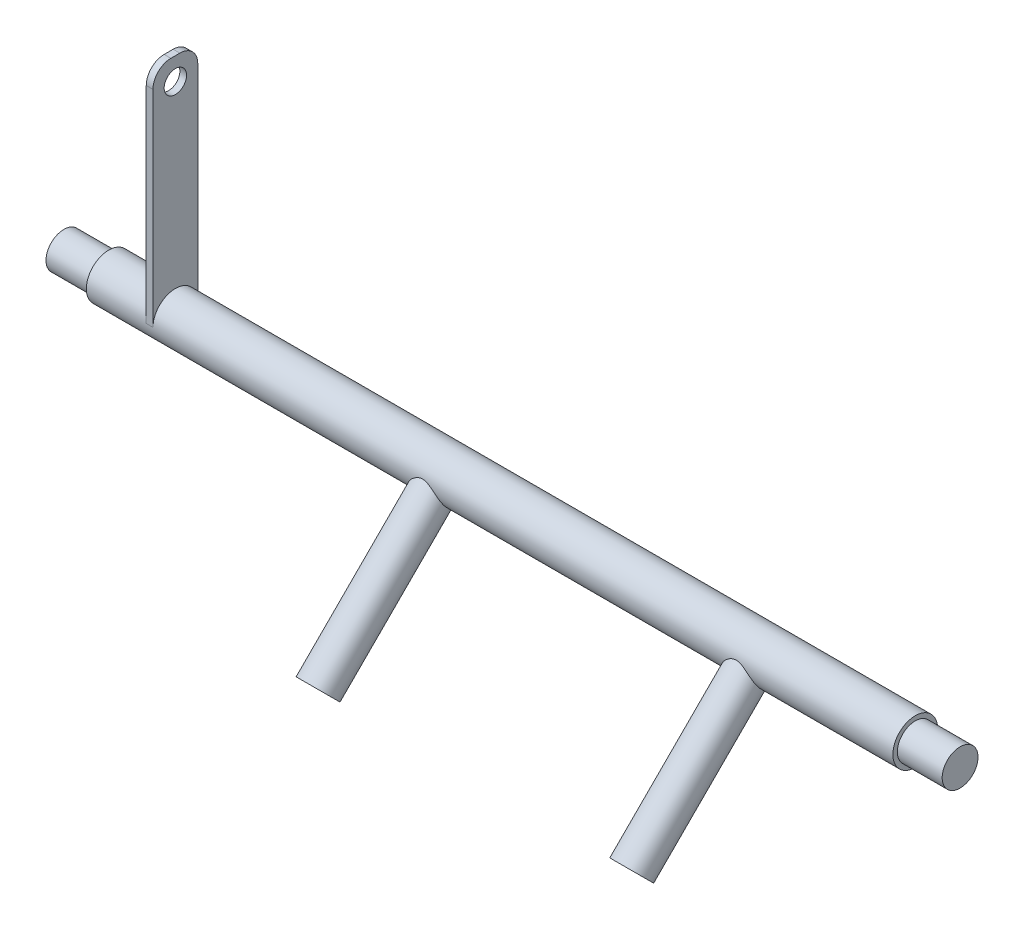
ISO-10303-21;
HEADER;
FILE_DESCRIPTION(('STEP AP214'),'2;1');
FILE_NAME('part.step','',(''),(''),'','','');
FILE_SCHEMA(('AUTOMOTIVE_DESIGN { 1 0 10303 214 1 1 1 1 }'));
ENDSEC;
DATA;
#1=APPLICATION_CONTEXT('core data for automotive mechanical design processes');
#2=APPLICATION_PROTOCOL_DEFINITION('international standard','automotive_design',2000,#1);
#3=PRODUCT_CONTEXT('',#1,'mechanical');
#4=PRODUCT('Part','Part','',(#3));
#5=PRODUCT_RELATED_PRODUCT_CATEGORY('part','',(#4));
#6=PRODUCT_DEFINITION_FORMATION('','',#4);
#7=PRODUCT_DEFINITION_CONTEXT('part definition',#1,'design');
#8=PRODUCT_DEFINITION('design','',#6,#7);
#9=PRODUCT_DEFINITION_SHAPE('','',#8);
#10=(LENGTH_UNIT() NAMED_UNIT(*) SI_UNIT(.MILLI.,.METRE.));
#11=(NAMED_UNIT(*) PLANE_ANGLE_UNIT() SI_UNIT($,.RADIAN.));
#12=(NAMED_UNIT(*) SI_UNIT($,.STERADIAN.) SOLID_ANGLE_UNIT());
#13=UNCERTAINTY_MEASURE_WITH_UNIT(LENGTH_MEASURE(1.E-05),#10,'distance_accuracy_value','');
#14=(GEOMETRIC_REPRESENTATION_CONTEXT(3) GLOBAL_UNCERTAINTY_ASSIGNED_CONTEXT((#13)) GLOBAL_UNIT_ASSIGNED_CONTEXT((#10,
#11,#12)) REPRESENTATION_CONTEXT('',''));
#15=CARTESIAN_POINT('',(0.,0.,0.));
#16=DIRECTION('',(0.,0.,1.));
#17=DIRECTION('',(1.,0.,0.));
#18=AXIS2_PLACEMENT_3D('',#15,#16,#17);
#19=CARTESIAN_POINT('',(200.,0.,0.));
#20=DIRECTION('',(-1.,0.,0.));
#21=DIRECTION('',(0.,0.,1.));
#22=AXIS2_PLACEMENT_3D('',#19,#20,#21);
#23=CYLINDRICAL_SURFACE('',#22,5.);
#24=CARTESIAN_POINT('',(86.8708289867169,0.,5.));
#25=CARTESIAN_POINT('',(86.9793998289822,-0.0812449391836092,4.99999920723166));
#26=CARTESIAN_POINT('',(87.0846153933995,-0.167032491447262,4.99801059737279));
#27=CARTESIAN_POINT('',(87.2884195353464,-0.345985964613619,4.98882133742379));
#28=CARTESIAN_POINT('',(87.3870028202996,-0.439157651922428,4.98161657751041));
#29=CARTESIAN_POINT('',(87.5776903995443,-0.631819299395804,4.96086844537602));
#30=CARTESIAN_POINT('',(87.6697747980685,-0.731327026199723,4.94730650399507));
#31=CARTESIAN_POINT('',(87.8467818851657,-0.935218036419223,4.91284702152889));
#32=CARTESIAN_POINT('',(87.931707374863,-1.03959938781692,4.89195236625242));
#33=CARTESIAN_POINT('',(88.1487102981684,-1.32403399682275,4.82497264035388));
#34=CARTESIAN_POINT('',(88.273990478684,-1.50767405850661,4.77140108410998));
#35=CARTESIAN_POINT('',(88.4991429971622,-1.88020909808587,4.63722518255168));
#36=CARTESIAN_POINT('',(88.5990756014864,-2.06909040415137,4.55668603457269));
#37=CARTESIAN_POINT('',(88.7540009903399,-2.4129895906888,4.38268184213806));
#38=CARTESIAN_POINT('',(88.8137833552939,-2.56819480481162,4.29388671176773));
#39=CARTESIAN_POINT('',(88.9097128085373,-2.87306886064256,4.09614605262623));
#40=CARTESIAN_POINT('',(88.9458700950944,-3.02274006486603,3.98720924452791));
#41=CARTESIAN_POINT('',(88.9923709406414,-3.31189065852307,3.75052000535699));
#42=CARTESIAN_POINT('',(89.0026129281885,-3.45132787189528,3.62269561075527));
#43=CARTESIAN_POINT('',(88.9962510880836,-3.71445861393116,3.35236740261508));
#44=CARTESIAN_POINT('',(88.9796485274838,-3.8381528853583,3.20986428220398));
#45=CARTESIAN_POINT('',(88.922667880246,-4.05912518840542,2.92472060847231));
#46=CARTESIAN_POINT('',(88.8838725384551,-4.15758438185366,2.78266766203189));
#47=CARTESIAN_POINT('',(88.7858869903079,-4.33663626358225,2.49447319654389));
#48=CARTESIAN_POINT('',(88.7266916715949,-4.41722446495655,2.34833066106386));
#49=CARTESIAN_POINT('',(88.5845549345228,-4.5669018225551,2.04321503312601));
#50=CARTESIAN_POINT('',(88.5000084258755,-4.63440465715769,1.88422004971271));
#51=CARTESIAN_POINT('',(88.3128859017784,-4.75009362429946,1.56993571483436));
#52=CARTESIAN_POINT('',(88.2103012038964,-4.79827041770672,1.4146481889706));
#53=CARTESIAN_POINT('',(87.9672691927458,-4.88551380226254,1.08041085345886));
#54=CARTESIAN_POINT('',(87.8233579292091,-4.92078698722834,0.903000319213625));
#55=CARTESIAN_POINT('',(87.5153697839587,-4.97116550800172,0.563040506268428));
#56=CARTESIAN_POINT('',(87.3512652235056,-4.98624281762266,0.400512170458568));
#57=CARTESIAN_POINT('',(87.0949084622267,-4.99741493006413,0.176407866343933));
#58=CARTESIAN_POINT('',(87.0100226419083,-4.99931535599653,0.106530036922283));
#59=CARTESIAN_POINT('',(86.8357782991457,-5.000372427147,-0.0275095370232505));
#60=CARTESIAN_POINT('',(86.7464190952593,-4.99952865307388,-0.091670406503846));
#61=CARTESIAN_POINT('',(86.5633358001229,-4.99582834453642,-0.21302369711527));
#62=CARTESIAN_POINT('',(86.4696199892205,-4.99297549339157,-0.270228646092274));
#63=CARTESIAN_POINT('',(86.2776660986073,-4.9860983379572,-0.376366645891483));
#64=CARTESIAN_POINT('',(86.1794289890549,-4.98207428400121,-0.425301460847371));
#65=CARTESIAN_POINT('',(85.9431164314671,-4.97233281886664,-0.528649419926916));
#66=CARTESIAN_POINT('',(85.8031790391184,-4.96651752182445,-0.578938414447918));
#67=CARTESIAN_POINT('',(85.5170912798506,-4.95690993688661,-0.656208229074297));
#68=CARTESIAN_POINT('',(85.3709561888701,-4.95311295532206,-0.683243218641756));
#69=CARTESIAN_POINT('',(85.0750403107533,-4.94928927739125,-0.710467851279436));
#70=CARTESIAN_POINT('',(84.9252416299379,-4.9492880747863,-0.710475972596045));
#71=CARTESIAN_POINT('',(84.6281475117094,-4.95312208776744,-0.683178530638466));
#72=CARTESIAN_POINT('',(84.4808554889329,-4.95696216750018,-0.65583833668592));
#73=CARTESIAN_POINT('',(84.160817198815,-4.96774786838422,-0.56898267951343));
#74=CARTESIAN_POINT('',(83.9897086894757,-4.97519469334109,-0.503657017694584));
#75=CARTESIAN_POINT('',(83.659688534087,-4.98856798078884,-0.346891660592394));
#76=CARTESIAN_POINT('',(83.5008149584119,-4.9944898222951,-0.255374328232258));
#77=CARTESIAN_POINT('',(83.2360623467594,-4.99991298267038,-0.0801801706545031));
#78=CARTESIAN_POINT('',(83.1272791776805,-5.00069803367004,-0.000829607363795815));
#79=CARTESIAN_POINT('',(82.9162841741232,-4.99793464074269,0.166191784138533));
#80=CARTESIAN_POINT('',(82.8140751740747,-4.99438434065401,0.253866161328792));
#81=CARTESIAN_POINT('',(82.6161425591152,-4.98178671217353,0.436069451259334));
#82=CARTESIAN_POINT('',(82.5204258350748,-4.97273364160196,0.530605433266652));
#83=CARTESIAN_POINT('',(82.3357447537895,-4.94809609280773,0.725235871264799));
#84=CARTESIAN_POINT('',(82.2467793231257,-4.93251265545843,0.825329439228892));
#85=CARTESIAN_POINT('',(82.0744168724165,-4.89351619925577,1.03186209540899));
#86=CARTESIAN_POINT('',(81.9911471135487,-4.86996878823433,1.1383824061148));
#87=CARTESIAN_POINT('',(81.8325460578982,-4.8141830298487,1.35504967960096));
#88=CARTESIAN_POINT('',(81.7572159932825,-4.7819433362769,1.46519720182007));
#89=CARTESIAN_POINT('',(81.6155232442639,-4.70802141513693,1.68766961426688));
#90=CARTESIAN_POINT('',(81.5491375373742,-4.66636419882207,1.79998802921589));
#91=CARTESIAN_POINT('',(81.4261609218319,-4.57291246986985,2.02568402007234));
#92=CARTESIAN_POINT('',(81.3695647629133,-4.52112342302892,2.13906099365595));
#93=CARTESIAN_POINT('',(81.2482741283435,-4.38568418185538,2.40747026863315));
#94=CARTESIAN_POINT('',(81.1883499956877,-4.29733887451242,2.56237032970448));
#95=CARTESIAN_POINT('',(81.092027867841,-4.10063724671074,2.86662562935454));
#96=CARTESIAN_POINT('',(81.0556118004243,-3.99229638077485,3.01598504393724));
#97=CARTESIAN_POINT('',(81.0084103996221,-3.75683600697762,3.30469114569692));
#98=CARTESIAN_POINT('',(80.9977298994759,-3.62964192480717,3.44399464465915));
#99=CARTESIAN_POINT('',(81.0030791691099,-3.36055982353189,3.70702482934759));
#100=CARTESIAN_POINT('',(81.019109163184,-3.21867168104714,3.83075138426133));
#101=CARTESIAN_POINT('',(81.0749615094739,-2.93431192428598,4.05219955811243));
#102=CARTESIAN_POINT('',(81.1132625853649,-2.79241104297494,4.15105143305933));
#103=CARTESIAN_POINT('',(81.2103117845329,-2.50442656572733,4.33090066314396));
#104=CARTESIAN_POINT('',(81.2690650907969,-2.3583419181645,4.41189348394876));
#105=CARTESIAN_POINT('',(81.4102217837965,-2.05351390641937,4.56227608862381));
#106=CARTESIAN_POINT('',(81.4942019578293,-1.8947420978273,4.6301110306738));
#107=CARTESIAN_POINT('',(81.6801948576486,-1.58081296315063,4.74648307685641));
#108=CARTESIAN_POINT('',(81.7822160251264,-1.42565736778917,4.79501111225798));
#109=CARTESIAN_POINT('',(82.0239162840215,-1.09172754541359,4.88299291240358));
#110=CARTESIAN_POINT('',(82.1670436894283,-0.914464780408133,4.91866927729797));
#111=CARTESIAN_POINT('',(82.4734088546489,-0.574612377973818,4.96984168702713));
#112=CARTESIAN_POINT('',(82.6366745696285,-0.412043692858507,4.98530932593476));
#113=CARTESIAN_POINT('',(82.8924423998191,-0.187046159721003,4.9970385425733));
#114=CARTESIAN_POINT('',(82.9776494693382,-0.116464948777004,4.99910308574929));
#115=CARTESIAN_POINT('',(83.1525900051176,0.0189552023215713,5.00042149540271));
#116=CARTESIAN_POINT('',(83.2423241910143,0.0837932249883831,4.99967491362224));
#117=CARTESIAN_POINT('',(83.4262150531255,0.206465620718764,4.99611168920189));
#118=CARTESIAN_POINT('',(83.520363548209,0.264312290239734,4.99329874446812));
#119=CARTESIAN_POINT('',(83.7132416934827,0.371680970075048,4.98645639161623));
#120=CARTESIAN_POINT('',(83.8119703385339,0.421204795958333,4.98242724934055));
#121=CARTESIAN_POINT('',(84.0488431364019,0.525552535593888,4.9726664268951));
#122=CARTESIAN_POINT('',(84.1888349994453,0.576310946396936,4.96682691965331));
#123=CARTESIAN_POINT('',(84.4750757153564,0.654534634413693,4.95713493532564));
#124=CARTESIAN_POINT('',(84.6213079797464,0.682058062477543,4.95327750716988));
#125=CARTESIAN_POINT('',(84.9174980349818,0.710232528218735,4.94932454719344));
#126=CARTESIAN_POINT('',(85.0674740980256,0.710704194009461,4.94925412603919));
#127=CARTESIAN_POINT('',(85.3650919941378,0.684222598254291,4.95297689025751));
#128=CARTESIAN_POINT('',(85.5127288961562,0.657217656752917,4.95677735628383));
#129=CARTESIAN_POINT('',(85.8329623097259,0.571096938106033,4.96750075206886));
#130=CARTESIAN_POINT('',(86.0039543326039,0.50624927397547,4.97492485320539));
#131=CARTESIAN_POINT('',(86.3334138583118,0.35057293146235,4.98830030992202));
#132=CARTESIAN_POINT('',(86.4918756950361,0.259732584066978,4.99425100179468));
#133=CARTESIAN_POINT('',(86.6825991177065,0.13411047249935,4.99826700589143));
#134=CARTESIAN_POINT('',(86.720815119702,0.108066301448417,4.99890311623502));
#135=CARTESIAN_POINT('',(86.7964266253376,0.0548567793628572,4.99976959957476));
#136=CARTESIAN_POINT('',(86.8338227109648,0.0276922658069492,5.00000027021439));
#137=CARTESIAN_POINT('',(86.8708289867169,0.,5.));
#138=B_SPLINE_CURVE_WITH_KNOTS('',3,(#24,#25,#26,#27,#28,#29,#30,#31,#32,#33,#34,#35,#36,#37,
#38,#39,#40,#41,#42,#43,#44,#45,#46,#47,#48,#49,#50,#51,#52,#53,#54,#55,#56,#57,#58,#59,#60,#61,
#62,#63,#64,#65,#66,#67,#68,#69,#70,#71,#72,#73,#74,#75,#76,#77,#78,#79,#80,#81,#82,#83,#84,#85,
#86,#87,#88,#89,#90,#91,#92,#93,#94,#95,#96,#97,#98,#99,#100,#101,#102,#103,#104,#105,#106,#107,
#108,#109,#110,#111,#112,#113,#114,#115,#116,#117,#118,#119,#120,#121,#122,#123,#124,#125,#126,
#127,#128,#129,#130,#131,#132,#133,#134,#135,#136,#137),.UNSPECIFIED.,.T.,.F.,(4,2,2,2,2,2,2,2,
2,2,2,2,2,2,2,2,2,2,2,2,2,2,2,2,2,2,2,2,2,2,2,2,2,2,2,2,2,2,2,2,2,2,2,2,2,2,2,2,2,2,2,2,2,2,2,2,
4),(0.,0.406762912918887,0.813846665058631,1.22212697930271,1.63024679361965,2.31342755131917,
2.99496842311953,3.55821424620046,4.1212167713277,4.68642251307253,5.25160157810565,
5.78075961901954,6.31005036666834,6.88488877781848,7.46000464068337,8.15103889185242,
8.84303111385966,9.17271095842023,9.50244117771741,9.83156845815155,10.1606254423376,
10.6053889046476,11.0491134768368,11.4958182500705,11.9430893944739,12.4899837252009,
13.0385162493637,13.4419957170784,13.845647993353,14.2497222084783,14.6537320428073,
15.0649312014861,15.4761940807971,15.8863772902242,16.2963398261777,16.8582152922313,
17.4196582909128,17.9833844769779,18.5471153968017,19.0762333891763,19.6054855679205,
20.1793774031676,20.7535384862844,21.4429630681143,22.1333556847298,22.4651274404409,
22.7969521022351,23.1281843819725,23.459344311697,23.9047482217928,24.3490340739624,
24.7962655102383,25.2443396890095,25.7904272318025,26.3367603178241,26.4755069976842,
26.6141517775086),.UNSPECIFIED.);
#139=CARTESIAN_POINT('',(86.8708289867169,0.,5.));
#140=VERTEX_POINT('',#139);
#141=EDGE_CURVE('E45',#140,#140,#138,.T.);
#142=ORIENTED_EDGE('',*,*,#141,.T.);
#143=EDGE_LOOP('',(#142));
#144=FACE_BOUND('',#143,.T.);
#145=CARTESIAN_POINT('',(156.870828986717,0.,5.));
#146=CARTESIAN_POINT('',(156.979399828983,-0.0812449391836084,4.99999920723166));
#147=CARTESIAN_POINT('',(157.0846153934,-0.167032491447264,4.99801059737279));
#148=CARTESIAN_POINT('',(157.288419535347,-0.345985964613618,4.98882133742379));
#149=CARTESIAN_POINT('',(157.3870028203,-0.439157651922423,4.98161657751042));
#150=CARTESIAN_POINT('',(157.577690399545,-0.631819299395794,4.96086844537603));
#151=CARTESIAN_POINT('',(157.669774798069,-0.731327026199714,4.94730650399507));
#152=CARTESIAN_POINT('',(157.846781885166,-0.935218036419212,4.91284702152889));
#153=CARTESIAN_POINT('',(157.931707374863,-1.03959938781691,4.89195236625242));
#154=CARTESIAN_POINT('',(158.148710298169,-1.32403399682273,4.82497264035388));
#155=CARTESIAN_POINT('',(158.273990478684,-1.5076740585066,4.77140108410998));
#156=CARTESIAN_POINT('',(158.499142997162,-1.88020909808586,4.63722518255169));
#157=CARTESIAN_POINT('',(158.599075601487,-2.06909040415136,4.5566860345727));
#158=CARTESIAN_POINT('',(158.75400099034,-2.4129895906888,4.38268184213806));
#159=CARTESIAN_POINT('',(158.813783355294,-2.56819480481162,4.29388671176774));
#160=CARTESIAN_POINT('',(158.909712808538,-2.87306886064256,4.09614605262624));
#161=CARTESIAN_POINT('',(158.945870095095,-3.02274006486603,3.98720924452791));
#162=CARTESIAN_POINT('',(158.992370940642,-3.31189065852308,3.75052000535699));
#163=CARTESIAN_POINT('',(159.002612928189,-3.45132787189528,3.62269561075526));
#164=CARTESIAN_POINT('',(158.996251088084,-3.71445861393117,3.35236740261507));
#165=CARTESIAN_POINT('',(158.979648527484,-3.83815288535831,3.20986428220397));
#166=CARTESIAN_POINT('',(158.922667880246,-4.05912518840543,2.9247206084723));
#167=CARTESIAN_POINT('',(158.883872538455,-4.15758438185366,2.78266766203187));
#168=CARTESIAN_POINT('',(158.785886990308,-4.33663626358226,2.49447319654388));
#169=CARTESIAN_POINT('',(158.726691671595,-4.41722446495656,2.34833066106385));
#170=CARTESIAN_POINT('',(158.584554934523,-4.5669018225551,2.043215033126));
#171=CARTESIAN_POINT('',(158.500008425876,-4.63440465715769,1.8842200497127));
#172=CARTESIAN_POINT('',(158.312885901779,-4.75009362429946,1.56993571483436));
#173=CARTESIAN_POINT('',(158.210301203897,-4.79827041770672,1.4146481889706));
#174=CARTESIAN_POINT('',(157.967269192746,-4.88551380226254,1.08041085345885));
#175=CARTESIAN_POINT('',(157.823357929209,-4.92078698722834,0.903000319213614));
#176=CARTESIAN_POINT('',(157.515369783959,-4.97116550800172,0.563040506268414));
#177=CARTESIAN_POINT('',(157.351265223506,-4.98624281762266,0.400512170458555));
#178=CARTESIAN_POINT('',(157.094908462227,-4.99741493006413,0.176407866343919));
#179=CARTESIAN_POINT('',(157.010022641909,-4.99931535599653,0.10653003692227));
#180=CARTESIAN_POINT('',(156.835778299146,-5.000372427147,-0.0275095370232689));
#181=CARTESIAN_POINT('',(156.74641909526,-4.99952865307388,-0.091670406503871));
#182=CARTESIAN_POINT('',(156.563335800123,-4.99582834453642,-0.213023697115302));
#183=CARTESIAN_POINT('',(156.469619989221,-4.99297549339157,-0.270228646092308));
#184=CARTESIAN_POINT('',(156.277666098608,-4.9860983379572,-0.376366645891516));
#185=CARTESIAN_POINT('',(156.179428989055,-4.98207428400121,-0.425301460847405));
#186=CARTESIAN_POINT('',(155.943116431467,-4.97233281886664,-0.528649419926949));
#187=CARTESIAN_POINT('',(155.803179039119,-4.96651752182445,-0.578938414447949));
#188=CARTESIAN_POINT('',(155.517091279851,-4.95690993688661,-0.656208229074319));
#189=CARTESIAN_POINT('',(155.37095618887,-4.95311295532206,-0.683243218641771));
#190=CARTESIAN_POINT('',(155.075040310754,-4.94928927739125,-0.710467851279448));
#191=CARTESIAN_POINT('',(154.925241629938,-4.9492880747863,-0.71047597259606));
#192=CARTESIAN_POINT('',(154.62814751171,-4.95312208776744,-0.683178530638481));
#193=CARTESIAN_POINT('',(154.480855488933,-4.95696216750018,-0.65583833668593));
#194=CARTESIAN_POINT('',(154.160817198815,-4.96774786838422,-0.568982679513434));
#195=CARTESIAN_POINT('',(153.989708689476,-4.97519469334109,-0.503657017694588));
#196=CARTESIAN_POINT('',(153.659688534087,-4.98856798078884,-0.346891660592405));
#197=CARTESIAN_POINT('',(153.500814958412,-4.9944898222951,-0.255374328232276));
#198=CARTESIAN_POINT('',(153.23606234676,-4.99991298267038,-0.080180170654516));
#199=CARTESIAN_POINT('',(153.127279177681,-5.00069803367004,-0.000829607363803336));
#200=CARTESIAN_POINT('',(152.916284174123,-4.99793464074269,0.166191784138532));
#201=CARTESIAN_POINT('',(152.814075174075,-4.99438434065401,0.253866161328792));
#202=CARTESIAN_POINT('',(152.616142559115,-4.98178671217353,0.436069451259333));
#203=CARTESIAN_POINT('',(152.520425835075,-4.97273364160196,0.530605433266647));
#204=CARTESIAN_POINT('',(152.33574475379,-4.94809609280773,0.725235871264789));
#205=CARTESIAN_POINT('',(152.246779323126,-4.93251265545843,0.825329439228882));
#206=CARTESIAN_POINT('',(152.074416872417,-4.89351619925577,1.03186209540899));
#207=CARTESIAN_POINT('',(151.991147113549,-4.86996878823433,1.13838240611481));
#208=CARTESIAN_POINT('',(151.832546057898,-4.8141830298487,1.35504967960097));
#209=CARTESIAN_POINT('',(151.757215993283,-4.7819433362769,1.46519720182007));
#210=CARTESIAN_POINT('',(151.615523244264,-4.70802141513693,1.68766961426688));
#211=CARTESIAN_POINT('',(151.549137537374,-4.66636419882206,1.7999880292159));
#212=CARTESIAN_POINT('',(151.426160921832,-4.57291246986984,2.02568402007236));
#213=CARTESIAN_POINT('',(151.369564762914,-4.52112342302892,2.13906099365596));
#214=CARTESIAN_POINT('',(151.248274128344,-4.38568418185538,2.40747026863316));
#215=CARTESIAN_POINT('',(151.188349995688,-4.29733887451242,2.56237032970449));
#216=CARTESIAN_POINT('',(151.092027867841,-4.10063724671073,2.86662562935454));
#217=CARTESIAN_POINT('',(151.055611800425,-3.99229638077484,3.01598504393725));
#218=CARTESIAN_POINT('',(151.008410399622,-3.75683600697761,3.30469114569693));
#219=CARTESIAN_POINT('',(150.997729899476,-3.62964192480716,3.44399464465917));
#220=CARTESIAN_POINT('',(151.00307916911,-3.36055982353188,3.70702482934761));
#221=CARTESIAN_POINT('',(151.019109163184,-3.21867168104712,3.83075138426134));
#222=CARTESIAN_POINT('',(151.074961509474,-2.93431192428596,4.05219955811244));
#223=CARTESIAN_POINT('',(151.113262585365,-2.79241104297492,4.15105143305934));
#224=CARTESIAN_POINT('',(151.210311784533,-2.50442656572731,4.33090066314398));
#225=CARTESIAN_POINT('',(151.269065090797,-2.35834191816448,4.41189348394877));
#226=CARTESIAN_POINT('',(151.410221783797,-2.05351390641935,4.56227608862382));
#227=CARTESIAN_POINT('',(151.49420195783,-1.89474209782728,4.63011103067381));
#228=CARTESIAN_POINT('',(151.680194857649,-1.58081296315061,4.74648307685642));
#229=CARTESIAN_POINT('',(151.782216025127,-1.42565736778915,4.79501111225799));
#230=CARTESIAN_POINT('',(152.023916284022,-1.09172754541358,4.88299291240359));
#231=CARTESIAN_POINT('',(152.167043689429,-0.914464780408118,4.91866927729798));
#232=CARTESIAN_POINT('',(152.473408854649,-0.574612377973802,4.96984168702713));
#233=CARTESIAN_POINT('',(152.636674569629,-0.412043692858485,4.98530932593476));
#234=CARTESIAN_POINT('',(152.892442399819,-0.187046159720984,4.9970385425733));
#235=CARTESIAN_POINT('',(152.977649469339,-0.116464948776987,4.99910308574929));
#236=CARTESIAN_POINT('',(153.152590005118,0.0189552023215889,5.00042149540271));
#237=CARTESIAN_POINT('',(153.242324191015,0.0837932249884024,4.99967491362224));
#238=CARTESIAN_POINT('',(153.426215053126,0.206465620718785,4.99611168920189));
#239=CARTESIAN_POINT('',(153.520363548209,0.264312290239756,4.99329874446812));
#240=CARTESIAN_POINT('',(153.713241693483,0.371680970075066,4.98645639161623));
#241=CARTESIAN_POINT('',(153.811970338534,0.421204795958347,4.98242724934055));
#242=CARTESIAN_POINT('',(154.048843136402,0.525552535593894,4.9726664268951));
#243=CARTESIAN_POINT('',(154.188834999446,0.576310946396935,4.96682691965331));
#244=CARTESIAN_POINT('',(154.475075715357,0.654534634413689,4.95713493532564));
#245=CARTESIAN_POINT('',(154.621307979747,0.682058062477542,4.95327750716988));
#246=CARTESIAN_POINT('',(154.917498034982,0.710232528218738,4.94932454719344));
#247=CARTESIAN_POINT('',(155.067474098026,0.710704194009469,4.94925412603919));
#248=CARTESIAN_POINT('',(155.365091994138,0.684222598254305,4.95297689025751));
#249=CARTESIAN_POINT('',(155.512728896156,0.657217656752929,4.95677735628383));
#250=CARTESIAN_POINT('',(155.832962309726,0.57109693810605,4.96750075206885));
#251=CARTESIAN_POINT('',(156.003954332604,0.506249273975497,4.97492485320539));
#252=CARTESIAN_POINT('',(156.333413858312,0.350572931462381,4.98830030992202));
#253=CARTESIAN_POINT('',(156.491875695036,0.259732584067002,4.99425100179467));
#254=CARTESIAN_POINT('',(156.682599117707,0.134110472499368,4.99826700589143));
#255=CARTESIAN_POINT('',(156.720815119702,0.108066301448429,4.99890311623502));
#256=CARTESIAN_POINT('',(156.796426625338,0.0548567793628621,4.99976959957476));
#257=CARTESIAN_POINT('',(156.833822710965,0.0276922658069518,5.00000027021439));
#258=CARTESIAN_POINT('',(156.870828986717,0.,5.));
#259=B_SPLINE_CURVE_WITH_KNOTS('',3,(#145,#146,#147,#148,#149,#150,#151,#152,#153,#154,#155,
#156,#157,#158,#159,#160,#161,#162,#163,#164,#165,#166,#167,#168,#169,#170,#171,#172,#173,#174,
#175,#176,#177,#178,#179,#180,#181,#182,#183,#184,#185,#186,#187,#188,#189,#190,#191,#192,#193,
#194,#195,#196,#197,#198,#199,#200,#201,#202,#203,#204,#205,#206,#207,#208,#209,#210,#211,#212,
#213,#214,#215,#216,#217,#218,#219,#220,#221,#222,#223,#224,#225,#226,#227,#228,#229,#230,#231,
#232,#233,#234,#235,#236,#237,#238,#239,#240,#241,#242,#243,#244,#245,#246,#247,#248,#249,#250,
#251,#252,#253,#254,#255,#256,#257,#258),.UNSPECIFIED.,.T.,.F.,(4,2,2,2,2,2,2,2,2,2,2,2,2,2,2,2,
2,2,2,2,2,2,2,2,2,2,2,2,2,2,2,2,2,2,2,2,2,2,2,2,2,2,2,2,2,2,2,2,2,2,2,2,2,2,2,2,4),(0.,
0.406762912918889,0.813846665058615,1.22212697930268,1.63024679361964,2.31342755131914,
2.99496842311952,3.55821424620046,4.12121677132769,4.68642251307253,5.25160157810566,
5.78075961901955,6.31005036666836,6.88488877781847,7.46000464068337,8.15103889185242,
8.84303111385969,9.17271095842025,9.50244117771744,9.83156845815163,10.1606254423377,
10.6053889046476,11.0491134768368,11.4958182500705,11.9430893944739,12.4899837252009,
13.0385162493637,13.4419957170784,13.845647993353,14.2497222084783,14.6537320428073,
15.0649312014861,15.4761940807971,15.8863772902243,16.2963398261777,16.8582152922314,
17.4196582909128,17.9833844769779,18.5471153968017,19.0762333891764,19.6054855679206,
20.1793774031677,20.7535384862845,21.4429630681144,22.1333556847298,22.465127440441,
22.7969521022351,23.1281843819725,23.459344311697,23.9047482217928,24.3490340739624,
24.7962655102382,25.2443396890095,25.7904272318025,26.3367603178241,26.4755069976843,
26.6141517775087),.UNSPECIFIED.);
#260=CARTESIAN_POINT('',(156.870828986717,0.,5.));
#261=VERTEX_POINT('',#260);
#262=EDGE_CURVE('E165',#261,#261,#259,.T.);
#263=ORIENTED_EDGE('',*,*,#262,.T.);
#264=EDGE_LOOP('',(#263));
#265=FACE_BOUND('',#264,.T.);
#266=CARTESIAN_POINT('',(190.,0.,0.));
#267=DIRECTION('',(1.,0.,0.));
#268=DIRECTION('',(0.,0.,-1.));
#269=AXIS2_PLACEMENT_3D('',#266,#267,#268);
#270=CIRCLE('',#269,5.);
#271=CARTESIAN_POINT('',(190.,0.,-5.));
#272=VERTEX_POINT('',#271);
#273=EDGE_CURVE('E140',#272,#272,#270,.T.);
#274=ORIENTED_EDGE('',*,*,#273,.F.);
#275=EDGE_LOOP('',(#274));
#276=FACE_BOUND('',#275,.T.);
#277=CARTESIAN_POINT('',(10.,0.,0.));
#278=DIRECTION('',(-1.,0.,0.));
#279=DIRECTION('',(0.,0.,1.));
#280=AXIS2_PLACEMENT_3D('',#277,#278,#279);
#281=CIRCLE('',#280,5.);
#282=CARTESIAN_POINT('',(10.,0.,5.));
#283=VERTEX_POINT('',#282);
#284=EDGE_CURVE('E149',#283,#283,#281,.T.);
#285=ORIENTED_EDGE('',*,*,#284,.F.);
#286=EDGE_LOOP('',(#285));
#287=FACE_BOUND('',#286,.T.);
#288=CARTESIAN_POINT('',(24.8722062931889,0.,0.));
#289=DIRECTION('',(-1.,0.,0.));
#290=DIRECTION('',(0.,0.,1.));
#291=AXIS2_PLACEMENT_3D('',#288,#289,#290);
#292=CIRCLE('',#291,5.);
#293=CARTESIAN_POINT('',(24.8722062931889,0.,5.));
#294=VERTEX_POINT('',#293);
#295=CARTESIAN_POINT('',(24.8722062931889,0.,-5.));
#296=VERTEX_POINT('',#295);
#297=EDGE_CURVE('E105',#294,#296,#292,.T.);
#298=ORIENTED_EDGE('',*,*,#297,.F.);
#299=DIRECTION('',(1.,0.,0.));
#300=VECTOR('',#299,1.);
#301=CARTESIAN_POINT('',(23.3722062931889,0.,5.));
#302=LINE('',#301,#300);
#303=CARTESIAN_POINT('',(23.3722062931889,0.,5.));
#304=VERTEX_POINT('',#303);
#305=EDGE_CURVE('E115',#304,#294,#302,.T.);
#306=ORIENTED_EDGE('',*,*,#305,.F.);
#307=CARTESIAN_POINT('',(23.3722062931889,0.,0.));
#308=DIRECTION('',(1.,0.,0.));
#309=DIRECTION('',(0.,0.,-1.));
#310=AXIS2_PLACEMENT_3D('',#307,#308,#309);
#311=CIRCLE('',#310,5.);
#312=CARTESIAN_POINT('',(23.3722062931889,0.,-5.));
#313=VERTEX_POINT('',#312);
#314=EDGE_CURVE('E120',#313,#304,#311,.T.);
#315=ORIENTED_EDGE('',*,*,#314,.F.);
#316=DIRECTION('',(-1.,0.,0.));
#317=VECTOR('',#316,1.);
#318=CARTESIAN_POINT('',(23.3722062931889,0.,-5.));
#319=LINE('',#318,#317);
#320=EDGE_CURVE('E118',#296,#313,#319,.T.);
#321=ORIENTED_EDGE('',*,*,#320,.F.);
#322=EDGE_LOOP('',(#298,#306,#315,#321));
#323=FACE_BOUND('',#322,.T.);
#324=ADVANCED_FACE('F41',(#144,#265,#276,#287,#323),#23,.T.);
#325=CARTESIAN_POINT('',(10.,0.,0.));
#326=DIRECTION('',(-1.,0.,0.));
#327=DIRECTION('',(0.,0.,1.));
#328=AXIS2_PLACEMENT_3D('',#325,#326,#327);
#329=PLANE('',#328);
#330=CARTESIAN_POINT('',(10.,0.,0.));
#331=DIRECTION('',(-1.,0.,0.));
#332=DIRECTION('',(0.,0.,1.));
#333=AXIS2_PLACEMENT_3D('',#330,#331,#332);
#334=CIRCLE('',#333,4.);
#335=CARTESIAN_POINT('',(10.,0.,4.));
#336=VERTEX_POINT('',#335);
#337=EDGE_CURVE('E146',#336,#336,#334,.T.);
#338=ORIENTED_EDGE('',*,*,#337,.F.);
#339=EDGE_LOOP('',(#338));
#340=FACE_BOUND('',#339,.T.);
#341=ORIENTED_EDGE('',*,*,#284,.T.);
#342=EDGE_LOOP('',(#341));
#343=FACE_BOUND('',#342,.T.);
#344=ADVANCED_FACE('F217',(#340,#343),#329,.T.);
#345=CARTESIAN_POINT('',(10.,0.,0.));
#346=DIRECTION('',(-1.,0.,0.));
#347=DIRECTION('',(0.,0.,1.));
#348=AXIS2_PLACEMENT_3D('',#345,#346,#347);
#349=CYLINDRICAL_SURFACE('',#348,4.);
#350=ORIENTED_EDGE('',*,*,#337,.T.);
#351=EDGE_LOOP('',(#350));
#352=FACE_BOUND('',#351,.T.);
#353=CARTESIAN_POINT('',(0.,0.,0.));
#354=DIRECTION('',(-1.,0.,0.));
#355=DIRECTION('',(0.,0.,1.));
#356=AXIS2_PLACEMENT_3D('',#353,#354,#355);
#357=CIRCLE('',#356,4.);
#358=CARTESIAN_POINT('',(0.,0.,4.));
#359=VERTEX_POINT('',#358);
#360=EDGE_CURVE('E145',#359,#359,#357,.T.);
#361=ORIENTED_EDGE('',*,*,#360,.F.);
#362=EDGE_LOOP('',(#361));
#363=FACE_BOUND('',#362,.T.);
#364=ADVANCED_FACE('F214',(#352,#363),#349,.T.);
#365=CARTESIAN_POINT('',(0.,0.,0.));
#366=DIRECTION('',(1.,0.,0.));
#367=DIRECTION('',(0.,0.,-1.));
#368=AXIS2_PLACEMENT_3D('',#365,#366,#367);
#369=PLANE('',#368);
#370=ORIENTED_EDGE('',*,*,#360,.T.);
#371=EDGE_LOOP('',(#370));
#372=FACE_BOUND('',#371,.T.);
#373=ADVANCED_FACE('F212',(#372),#369,.F.);
#374=CARTESIAN_POINT('',(190.,0.,0.));
#375=DIRECTION('',(1.,0.,0.));
#376=DIRECTION('',(0.,0.,-1.));
#377=AXIS2_PLACEMENT_3D('',#374,#375,#376);
#378=PLANE('',#377);
#379=CARTESIAN_POINT('',(190.,0.,0.));
#380=DIRECTION('',(1.,0.,0.));
#381=DIRECTION('',(0.,0.,-1.));
#382=AXIS2_PLACEMENT_3D('',#379,#380,#381);
#383=CIRCLE('',#382,4.);
#384=CARTESIAN_POINT('',(190.,0.,-4.));
#385=VERTEX_POINT('',#384);
#386=EDGE_CURVE('E137',#385,#385,#383,.T.);
#387=ORIENTED_EDGE('',*,*,#386,.F.);
#388=EDGE_LOOP('',(#387));
#389=FACE_BOUND('',#388,.T.);
#390=ORIENTED_EDGE('',*,*,#273,.T.);
#391=EDGE_LOOP('',(#390));
#392=FACE_BOUND('',#391,.T.);
#393=ADVANCED_FACE('F208',(#389,#392),#378,.T.);
#394=CARTESIAN_POINT('',(190.,0.,0.));
#395=DIRECTION('',(1.,0.,0.));
#396=DIRECTION('',(0.,0.,-1.));
#397=AXIS2_PLACEMENT_3D('',#394,#395,#396);
#398=CYLINDRICAL_SURFACE('',#397,4.);
#399=ORIENTED_EDGE('',*,*,#386,.T.);
#400=EDGE_LOOP('',(#399));
#401=FACE_BOUND('',#400,.T.);
#402=CARTESIAN_POINT('',(200.,0.,0.));
#403=DIRECTION('',(1.,0.,0.));
#404=DIRECTION('',(0.,0.,-1.));
#405=AXIS2_PLACEMENT_3D('',#402,#403,#404);
#406=CIRCLE('',#405,4.);
#407=CARTESIAN_POINT('',(200.,0.,-4.));
#408=VERTEX_POINT('',#407);
#409=EDGE_CURVE('E136',#408,#408,#406,.T.);
#410=ORIENTED_EDGE('',*,*,#409,.F.);
#411=EDGE_LOOP('',(#410));
#412=FACE_BOUND('',#411,.T.);
#413=ADVANCED_FACE('F205',(#401,#412),#398,.T.);
#414=CARTESIAN_POINT('',(200.,0.,0.));
#415=DIRECTION('',(1.,0.,0.));
#416=DIRECTION('',(0.,0.,-1.));
#417=AXIS2_PLACEMENT_3D('',#414,#415,#416);
#418=PLANE('',#417);
#419=ORIENTED_EDGE('',*,*,#409,.T.);
#420=EDGE_LOOP('',(#419));
#421=FACE_BOUND('',#420,.T.);
#422=ADVANCED_FACE('F203',(#421),#418,.T.);
#423=CARTESIAN_POINT('',(24.8722062931889,50.,-5.));
#424=DIRECTION('',(-1.,0.,0.));
#425=DIRECTION('',(0.,0.,1.));
#426=AXIS2_PLACEMENT_3D('',#423,#424,#425);
#427=PLANE('',#426);
#428=CARTESIAN_POINT('',(24.8722062931889,45.,0.));
#429=DIRECTION('',(-1.,0.,0.));
#430=DIRECTION('',(0.,0.,1.));
#431=AXIS2_PLACEMENT_3D('',#428,#429,#430);
#432=CIRCLE('',#431,2.5);
#433=CARTESIAN_POINT('',(24.8722062931889,45.,2.5));
#434=VERTEX_POINT('',#433);
#435=EDGE_CURVE('E127',#434,#434,#432,.T.);
#436=ORIENTED_EDGE('',*,*,#435,.T.);
#437=EDGE_LOOP('',(#436));
#438=FACE_BOUND('',#437,.T.);
#439=DIRECTION('',(0.,0.,-1.));
#440=VECTOR('',#439,1.);
#441=CARTESIAN_POINT('',(24.8722062931889,50.,-5.));
#442=LINE('',#441,#440);
#443=CARTESIAN_POINT('',(24.8722062931889,50.,1.));
#444=VERTEX_POINT('',#443);
#445=CARTESIAN_POINT('',(24.8722062931889,50.,-1.));
#446=VERTEX_POINT('',#445);
#447=EDGE_CURVE('E123',#444,#446,#442,.T.);
#448=ORIENTED_EDGE('',*,*,#447,.F.);
#449=CARTESIAN_POINT('',(24.8722062931889,46.,1.));
#450=DIRECTION('',(-1.,0.,0.));
#451=DIRECTION('',(0.,0.,1.));
#452=AXIS2_PLACEMENT_3D('',#449,#450,#451);
#453=CIRCLE('',#452,4.);
#454=CARTESIAN_POINT('',(24.8722062931889,46.,5.));
#455=VERTEX_POINT('',#454);
#456=EDGE_CURVE('E106',#444,#455,#453,.F.);
#457=ORIENTED_EDGE('',*,*,#456,.T.);
#458=DIRECTION('',(0.,-1.,0.));
#459=VECTOR('',#458,1.);
#460=CARTESIAN_POINT('',(24.8722062931889,50.,5.));
#461=LINE('',#460,#459);
#462=EDGE_CURVE('E100',#455,#294,#461,.T.);
#463=ORIENTED_EDGE('',*,*,#462,.T.);
#464=ORIENTED_EDGE('',*,*,#297,.T.);
#465=DIRECTION('',(0.,-1.,0.));
#466=VECTOR('',#465,1.);
#467=CARTESIAN_POINT('',(24.8722062931889,50.,-5.));
#468=LINE('',#467,#466);
#469=CARTESIAN_POINT('',(24.8722062931889,46.,-5.));
#470=VERTEX_POINT('',#469);
#471=EDGE_CURVE('E134',#470,#296,#468,.T.);
#472=ORIENTED_EDGE('',*,*,#471,.F.);
#473=CARTESIAN_POINT('',(24.8722062931889,46.,-1.));
#474=DIRECTION('',(-1.,0.,0.));
#475=DIRECTION('',(0.,0.,1.));
#476=AXIS2_PLACEMENT_3D('',#473,#474,#475);
#477=CIRCLE('',#476,4.);
#478=EDGE_CURVE('E160',#470,#446,#477,.F.);
#479=ORIENTED_EDGE('',*,*,#478,.T.);
#480=EDGE_LOOP('',(#448,#457,#463,#464,#472,#479));
#481=FACE_BOUND('',#480,.T.);
#482=ADVANCED_FACE('F103',(#438,#481),#427,.F.);
#483=CARTESIAN_POINT('',(23.3722062931889,50.,-5.));
#484=DIRECTION('',(0.,0.,1.));
#485=DIRECTION('',(1.,0.,0.));
#486=AXIS2_PLACEMENT_3D('',#483,#484,#485);
#487=PLANE('',#486);
#488=DIRECTION('',(0.,-1.,0.));
#489=VECTOR('',#488,1.);
#490=CARTESIAN_POINT('',(23.3722062931889,50.,-5.));
#491=LINE('',#490,#489);
#492=CARTESIAN_POINT('',(23.3722062931889,46.,-5.));
#493=VERTEX_POINT('',#492);
#494=EDGE_CURVE('E132',#493,#313,#491,.T.);
#495=ORIENTED_EDGE('',*,*,#494,.F.);
#496=DIRECTION('',(-1.,0.,0.));
#497=VECTOR('',#496,1.);
#498=CARTESIAN_POINT('',(24.8722062931889,46.,-5.));
#499=LINE('',#498,#497);
#500=EDGE_CURVE('E11',#493,#470,#499,.F.);
#501=ORIENTED_EDGE('',*,*,#500,.T.);
#502=ORIENTED_EDGE('',*,*,#471,.T.);
#503=ORIENTED_EDGE('',*,*,#320,.T.);
#504=EDGE_LOOP('',(#495,#501,#502,#503));
#505=FACE_BOUND('',#504,.T.);
#506=ADVANCED_FACE('F196',(#505),#487,.F.);
#507=CARTESIAN_POINT('',(23.3722062931889,50.,-5.));
#508=DIRECTION('',(1.,0.,0.));
#509=DIRECTION('',(0.,0.,-1.));
#510=AXIS2_PLACEMENT_3D('',#507,#508,#509);
#511=PLANE('',#510);
#512=CARTESIAN_POINT('',(23.3722062931889,45.,0.));
#513=DIRECTION('',(-1.,0.,0.));
#514=DIRECTION('',(0.,0.,1.));
#515=AXIS2_PLACEMENT_3D('',#512,#513,#514);
#516=CIRCLE('',#515,2.5);
#517=CARTESIAN_POINT('',(23.3722062931889,45.,2.5));
#518=VERTEX_POINT('',#517);
#519=EDGE_CURVE('E171',#518,#518,#516,.T.);
#520=ORIENTED_EDGE('',*,*,#519,.F.);
#521=EDGE_LOOP('',(#520));
#522=FACE_BOUND('',#521,.T.);
#523=DIRECTION('',(0.,-1.,0.));
#524=VECTOR('',#523,1.);
#525=CARTESIAN_POINT('',(23.3722062931889,50.,5.));
#526=LINE('',#525,#524);
#527=CARTESIAN_POINT('',(23.3722062931889,46.,5.));
#528=VERTEX_POINT('',#527);
#529=EDGE_CURVE('E108',#528,#304,#526,.T.);
#530=ORIENTED_EDGE('',*,*,#529,.F.);
#531=CARTESIAN_POINT('',(23.3722062931889,46.,1.));
#532=DIRECTION('',(1.,0.,0.));
#533=DIRECTION('',(0.,0.,-1.));
#534=AXIS2_PLACEMENT_3D('',#531,#532,#533);
#535=CIRCLE('',#534,4.);
#536=CARTESIAN_POINT('',(23.3722062931889,50.,1.));
#537=VERTEX_POINT('',#536);
#538=EDGE_CURVE('E55',#528,#537,#535,.F.);
#539=ORIENTED_EDGE('',*,*,#538,.T.);
#540=DIRECTION('',(0.,0.,1.));
#541=VECTOR('',#540,1.);
#542=CARTESIAN_POINT('',(23.3722062931889,50.,-5.));
#543=LINE('',#542,#541);
#544=CARTESIAN_POINT('',(23.3722062931889,50.,-1.));
#545=VERTEX_POINT('',#544);
#546=EDGE_CURVE('E109',#545,#537,#543,.T.);
#547=ORIENTED_EDGE('',*,*,#546,.F.);
#548=CARTESIAN_POINT('',(23.3722062931889,46.,-1.));
#549=DIRECTION('',(1.,0.,0.));
#550=DIRECTION('',(0.,0.,-1.));
#551=AXIS2_PLACEMENT_3D('',#548,#549,#550);
#552=CIRCLE('',#551,4.);
#553=EDGE_CURVE('E63',#545,#493,#552,.F.);
#554=ORIENTED_EDGE('',*,*,#553,.T.);
#555=ORIENTED_EDGE('',*,*,#494,.T.);
#556=ORIENTED_EDGE('',*,*,#314,.T.);
#557=EDGE_LOOP('',(#530,#539,#547,#554,#555,#556));
#558=FACE_BOUND('',#557,.T.);
#559=ADVANCED_FACE('F193',(#522,#558),#511,.F.);
#560=CARTESIAN_POINT('',(23.3722062931889,50.,5.));
#561=DIRECTION('',(0.,0.,-1.));
#562=DIRECTION('',(-1.,0.,0.));
#563=AXIS2_PLACEMENT_3D('',#560,#561,#562);
#564=PLANE('',#563);
#565=ORIENTED_EDGE('',*,*,#462,.F.);
#566=DIRECTION('',(1.,0.,0.));
#567=VECTOR('',#566,1.);
#568=CARTESIAN_POINT('',(23.3722062931889,46.,5.));
#569=LINE('',#568,#567);
#570=EDGE_CURVE('E71',#455,#528,#569,.F.);
#571=ORIENTED_EDGE('',*,*,#570,.T.);
#572=ORIENTED_EDGE('',*,*,#529,.T.);
#573=ORIENTED_EDGE('',*,*,#305,.T.);
#574=EDGE_LOOP('',(#565,#571,#572,#573));
#575=FACE_BOUND('',#574,.T.);
#576=ADVANCED_FACE('F122',(#575),#564,.F.);
#577=CARTESIAN_POINT('',(0.,50.,0.));
#578=DIRECTION('',(0.,1.,0.));
#579=DIRECTION('',(0.,0.,1.));
#580=AXIS2_PLACEMENT_3D('',#577,#578,#579);
#581=PLANE('',#580);
#582=ORIENTED_EDGE('',*,*,#546,.T.);
#583=DIRECTION('',(1.,0.,0.));
#584=VECTOR('',#583,1.);
#585=CARTESIAN_POINT('',(24.8722062931889,50.,1.));
#586=LINE('',#585,#584);
#587=EDGE_CURVE('E157',#537,#444,#586,.T.);
#588=ORIENTED_EDGE('',*,*,#587,.T.);
#589=ORIENTED_EDGE('',*,*,#447,.T.);
#590=DIRECTION('',(-1.,0.,0.));
#591=VECTOR('',#590,1.);
#592=CARTESIAN_POINT('',(23.3722062931889,50.,-1.));
#593=LINE('',#592,#591);
#594=EDGE_CURVE('E119',#446,#545,#593,.T.);
#595=ORIENTED_EDGE('',*,*,#594,.T.);
#596=EDGE_LOOP('',(#582,#588,#589,#595));
#597=FACE_BOUND('',#596,.T.);
#598=ADVANCED_FACE('F186',(#597),#581,.T.);
#599=CARTESIAN_POINT('',(73.3722062931889,45.,0.));
#600=DIRECTION('',(-1.,0.,0.));
#601=DIRECTION('',(0.,0.,1.));
#602=AXIS2_PLACEMENT_3D('',#599,#600,#601);
#603=CYLINDRICAL_SURFACE('',#602,2.5);
#604=ORIENTED_EDGE('',*,*,#519,.T.);
#605=EDGE_LOOP('',(#604));
#606=FACE_BOUND('',#605,.T.);
#607=ORIENTED_EDGE('',*,*,#435,.F.);
#608=EDGE_LOOP('',(#607));
#609=FACE_BOUND('',#608,.T.);
#610=ADVANCED_FACE('F182',(#606,#609),#603,.F.);
#611=CARTESIAN_POINT('',(0.,46.,1.));
#612=DIRECTION('',(-1.,0.,0.));
#613=DIRECTION('',(0.,0.,1.));
#614=AXIS2_PLACEMENT_3D('',#611,#612,#613);
#615=CYLINDRICAL_SURFACE('',#614,4.);
#616=ORIENTED_EDGE('',*,*,#538,.F.);
#617=ORIENTED_EDGE('',*,*,#570,.F.);
#618=ORIENTED_EDGE('',*,*,#456,.F.);
#619=ORIENTED_EDGE('',*,*,#587,.F.);
#620=EDGE_LOOP('',(#616,#617,#618,#619));
#621=FACE_BOUND('',#620,.T.);
#622=ADVANCED_FACE('F185',(#621),#615,.T.);
#623=CARTESIAN_POINT('',(0.,46.,-1.));
#624=DIRECTION('',(1.,0.,0.));
#625=DIRECTION('',(0.,0.,-1.));
#626=AXIS2_PLACEMENT_3D('',#623,#624,#625);
#627=CYLINDRICAL_SURFACE('',#626,4.);
#628=ORIENTED_EDGE('',*,*,#478,.F.);
#629=ORIENTED_EDGE('',*,*,#500,.F.);
#630=ORIENTED_EDGE('',*,*,#553,.F.);
#631=ORIENTED_EDGE('',*,*,#594,.F.);
#632=EDGE_LOOP('',(#628,#629,#630,#631));
#633=FACE_BOUND('',#632,.T.);
#634=ADVANCED_FACE('F43',(#633),#627,.T.);
#635=CARTESIAN_POINT('',(155.000003318646,-28.2842621542427,28.2842621542426));
#636=DIRECTION('',(-8.29661542302608E-08,0.707106781186546,-0.707106781186544));
#637=DIRECTION('',(0.,0.707106781186546,0.707106781186549));
#638=AXIS2_PLACEMENT_3D('',#635,#636,#637);
#639=CYLINDRICAL_SURFACE('',#638,4.00000000000001);
#640=CARTESIAN_POINT('',(155.000003318646,-28.2842621542427,28.2842621542426));
#641=DIRECTION('',(-8.29661542302608E-08,0.707106781186546,-0.707106781186544));
#642=DIRECTION('',(0.,0.707106781186546,0.707106781186549));
#643=AXIS2_PLACEMENT_3D('',#640,#641,#642);
#644=CIRCLE('',#643,4.00000000000001);
#645=CARTESIAN_POINT('',(155.000003318646,-25.4558350294965,31.1126892789888));
#646=VERTEX_POINT('',#645);
#647=EDGE_CURVE('E172',#646,#646,#644,.T.);
#648=ORIENTED_EDGE('',*,*,#647,.T.);
#649=EDGE_LOOP('',(#648));
#650=FACE_BOUND('',#649,.T.);
#651=ORIENTED_EDGE('',*,*,#262,.F.);
#652=EDGE_LOOP('',(#651));
#653=FACE_BOUND('',#652,.T.);
#654=ADVANCED_FACE('F175',(#650,#653),#639,.T.);
#655=CARTESIAN_POINT('',(155.000003318646,-28.2842621542427,28.2842621542426));
#656=DIRECTION('',(-8.29661542302608E-08,0.707106781186546,-0.707106781186544));
#657=DIRECTION('',(0.,0.707106781186546,0.707106781186549));
#658=AXIS2_PLACEMENT_3D('',#655,#656,#657);
#659=PLANE('',#658);
#660=ORIENTED_EDGE('',*,*,#647,.F.);
#661=EDGE_LOOP('',(#660));
#662=FACE_BOUND('',#661,.T.);
#663=ADVANCED_FACE('F180',(#662),#659,.F.);
#664=CARTESIAN_POINT('',(85.0000033186459,-28.2842662608578,28.2842662608577));
#665=DIRECTION('',(-8.29661542302608E-08,0.707106781186546,-0.707106781186544));
#666=DIRECTION('',(0.,0.707106781186546,0.707106781186549));
#667=AXIS2_PLACEMENT_3D('',#664,#665,#666);
#668=CYLINDRICAL_SURFACE('',#667,4.);
#669=CARTESIAN_POINT('',(85.0000033186459,-28.2842662608578,28.2842662608577));
#670=DIRECTION('',(-8.29661542302608E-08,0.707106781186546,-0.707106781186544));
#671=DIRECTION('',(0.,0.707106781186546,0.707106781186549));
#672=AXIS2_PLACEMENT_3D('',#669,#670,#671);
#673=CIRCLE('',#672,4.);
#674=CARTESIAN_POINT('',(85.0000033186459,-25.4558391361116,31.1126933856039));
#675=VERTEX_POINT('',#674);
#676=EDGE_CURVE('E244',#675,#675,#673,.T.);
#677=ORIENTED_EDGE('',*,*,#676,.T.);
#678=EDGE_LOOP('',(#677));
#679=FACE_BOUND('',#678,.T.);
#680=ORIENTED_EDGE('',*,*,#141,.F.);
#681=EDGE_LOOP('',(#680));
#682=FACE_BOUND('',#681,.T.);
#683=ADVANCED_FACE('F362',(#679,#682),#668,.T.);
#684=CARTESIAN_POINT('',(85.0000033186459,-28.2842662608578,28.2842662608577));
#685=DIRECTION('',(-8.29661542302608E-08,0.707106781186546,-0.707106781186544));
#686=DIRECTION('',(0.,0.707106781186546,0.707106781186549));
#687=AXIS2_PLACEMENT_3D('',#684,#685,#686);
#688=PLANE('',#687);
#689=ORIENTED_EDGE('',*,*,#676,.F.);
#690=EDGE_LOOP('',(#689));
#691=FACE_BOUND('',#690,.T.);
#692=ADVANCED_FACE('F370',(#691),#688,.F.);
#693=CLOSED_SHELL('',(#324,#344,#364,#373,#393,#413,#422,#482,#506,#559,#576,#598,#610,#622,
#634,#654,#663,#683,#692));
#694=MANIFOLD_SOLID_BREP('B2',#693);
#695=ADVANCED_BREP_SHAPE_REPRESENTATION('',(#18,#694),#14);
#696=SHAPE_DEFINITION_REPRESENTATION(#9,#695);
ENDSEC;
END-ISO-10303-21;
